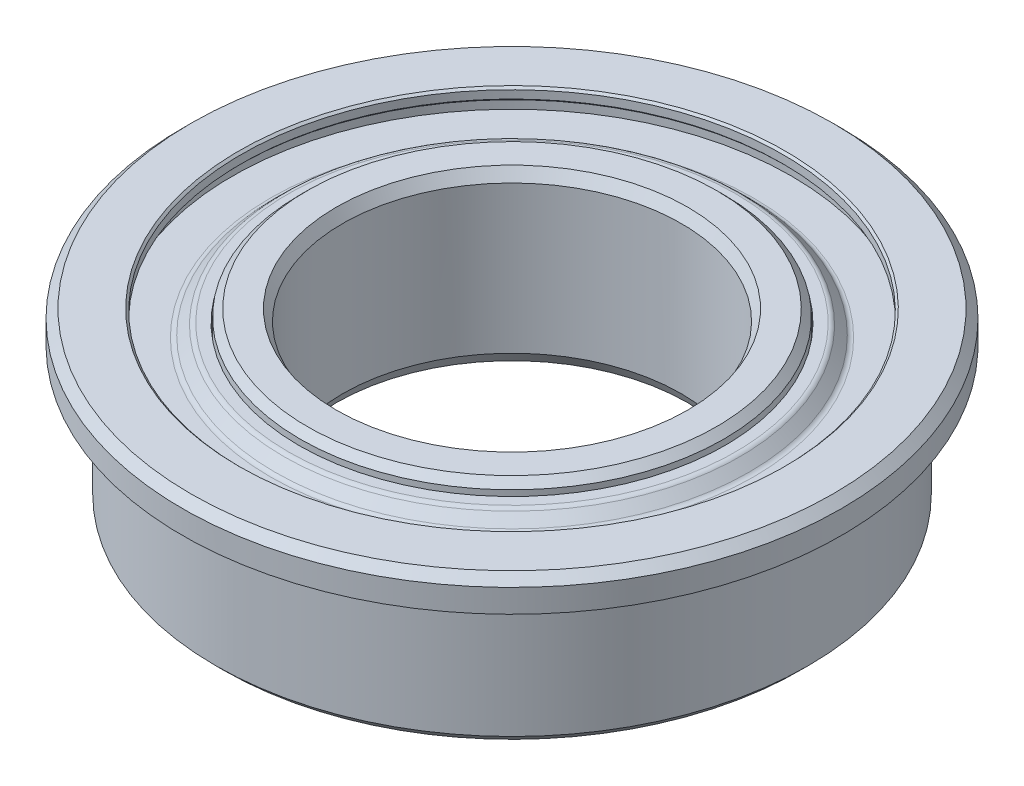
ISO-10303-21;
HEADER;
FILE_DESCRIPTION(('STEP AP214'),'2;1');
FILE_NAME('part.step','',(''),(''),'','','');
FILE_SCHEMA(('AUTOMOTIVE_DESIGN { 1 0 10303 214 1 1 1 1 }'));
ENDSEC;
DATA;
#1=APPLICATION_CONTEXT('core data for automotive mechanical design processes');
#2=APPLICATION_PROTOCOL_DEFINITION('international standard','automotive_design',2000,#1);
#3=PRODUCT_CONTEXT('',#1,'mechanical');
#4=PRODUCT('Part','Part','',(#3));
#5=PRODUCT_RELATED_PRODUCT_CATEGORY('part','',(#4));
#6=PRODUCT_DEFINITION_FORMATION('','',#4);
#7=PRODUCT_DEFINITION_CONTEXT('part definition',#1,'design');
#8=PRODUCT_DEFINITION('design','',#6,#7);
#9=PRODUCT_DEFINITION_SHAPE('','',#8);
#10=(LENGTH_UNIT() NAMED_UNIT(*) SI_UNIT(.MILLI.,.METRE.));
#11=(NAMED_UNIT(*) PLANE_ANGLE_UNIT() SI_UNIT($,.RADIAN.));
#12=(NAMED_UNIT(*) SI_UNIT($,.STERADIAN.) SOLID_ANGLE_UNIT());
#13=UNCERTAINTY_MEASURE_WITH_UNIT(LENGTH_MEASURE(1.E-05),#10,'distance_accuracy_value','');
#14=(GEOMETRIC_REPRESENTATION_CONTEXT(3) GLOBAL_UNCERTAINTY_ASSIGNED_CONTEXT((#13)) GLOBAL_UNIT_ASSIGNED_CONTEXT((#10,
#11,#12)) REPRESENTATION_CONTEXT('',''));
#15=CARTESIAN_POINT('',(0.,0.,0.));
#16=DIRECTION('',(0.,0.,1.));
#17=DIRECTION('',(1.,0.,0.));
#18=AXIS2_PLACEMENT_3D('',#15,#16,#17);
#19=CARTESIAN_POINT('',(0.,3.83000000010725,0.));
#20=DIRECTION('',(0.,-1.,0.));
#21=DIRECTION('',(0.,0.,-1.));
#22=AXIS2_PLACEMENT_3D('',#19,#20,#21);
#23=CONICAL_SURFACE('',#22,4.99999999993861,0.785398163230262);
#24=CARTESIAN_POINT('',(0.,3.83,0.));
#25=DIRECTION('',(0.,1.,0.));
#26=DIRECTION('',(0.,0.,1.));
#27=AXIS2_PLACEMENT_3D('',#24,#25,#26);
#28=CIRCLE('',#27,5.);
#29=CARTESIAN_POINT('',(0.,3.83,5.));
#30=VERTEX_POINT('',#29);
#31=EDGE_CURVE('E410',#30,#30,#28,.F.);
#32=ORIENTED_EDGE('',*,*,#31,.F.);
#33=EDGE_LOOP('',(#32));
#34=FACE_BOUND('',#33,.T.);
#35=CARTESIAN_POINT('',(0.,4.0000000000191,0.));
#36=DIRECTION('',(0.,-1.,0.));
#37=DIRECTION('',(0.,0.,-1.));
#38=AXIS2_PLACEMENT_3D('',#35,#36,#37);
#39=CIRCLE('',#38,4.8300000000836);
#40=CARTESIAN_POINT('',(0.,4.0000000000191,-4.8300000000836));
#41=VERTEX_POINT('',#40);
#42=EDGE_CURVE('E408',#41,#41,#39,.F.);
#43=ORIENTED_EDGE('',*,*,#42,.F.);
#44=EDGE_LOOP('',(#43));
#45=FACE_BOUND('',#44,.T.);
#46=ADVANCED_FACE('F17',(#34,#45),#23,.T.);
#47=CARTESIAN_POINT('',(0.,3.71,0.));
#48=DIRECTION('',(0.,1.,0.));
#49=DIRECTION('',(0.,0.,1.));
#50=AXIS2_PLACEMENT_3D('',#47,#48,#49);
#51=CYLINDRICAL_SURFACE('',#50,5.);
#52=ORIENTED_EDGE('',*,*,#31,.T.);
#53=EDGE_LOOP('',(#52));
#54=FACE_BOUND('',#53,.T.);
#55=CARTESIAN_POINT('',(0.,3.456,0.));
#56=DIRECTION('',(0.,1.,0.));
#57=DIRECTION('',(0.,0.,1.));
#58=AXIS2_PLACEMENT_3D('',#55,#56,#57);
#59=CIRCLE('',#58,5.);
#60=CARTESIAN_POINT('',(0.,3.456,5.));
#61=VERTEX_POINT('',#60);
#62=EDGE_CURVE('E406',#61,#61,#59,.F.);
#63=ORIENTED_EDGE('',*,*,#62,.F.);
#64=EDGE_LOOP('',(#63));
#65=FACE_BOUND('',#64,.T.);
#66=ADVANCED_FACE('F127',(#54,#65),#51,.T.);
#67=CARTESIAN_POINT('',(0.,4.,0.));
#68=DIRECTION('',(0.,1.,0.));
#69=DIRECTION('',(0.,0.,1.));
#70=AXIS2_PLACEMENT_3D('',#67,#68,#69);
#71=PLANE('',#70);
#72=CARTESIAN_POINT('',(0.,4.0000000000191,0.));
#73=DIRECTION('',(0.,1.,0.));
#74=DIRECTION('',(0.,0.,1.));
#75=AXIS2_PLACEMENT_3D('',#72,#73,#74);
#76=CIRCLE('',#75,4.15000000003829);
#77=CARTESIAN_POINT('',(0.,4.0000000000191,4.15000000003829));
#78=VERTEX_POINT('',#77);
#79=EDGE_CURVE('E403',#78,#78,#76,.F.);
#80=ORIENTED_EDGE('',*,*,#79,.T.);
#81=EDGE_LOOP('',(#80));
#82=FACE_BOUND('',#81,.T.);
#83=ORIENTED_EDGE('',*,*,#42,.T.);
#84=EDGE_LOOP('',(#83));
#85=FACE_BOUND('',#84,.T.);
#86=ADVANCED_FACE('F124',(#82,#85),#71,.T.);
#87=CARTESIAN_POINT('',(0.,3.456,0.));
#88=DIRECTION('',(0.,1.,0.));
#89=DIRECTION('',(0.,0.,1.));
#90=AXIS2_PLACEMENT_3D('',#87,#88,#89);
#91=PLANE('',#90);
#92=CARTESIAN_POINT('',(0.,3.456,0.));
#93=DIRECTION('',(0.,1.,0.));
#94=DIRECTION('',(0.,0.,1.));
#95=AXIS2_PLACEMENT_3D('',#92,#93,#94);
#96=CIRCLE('',#95,5.025);
#97=CARTESIAN_POINT('',(0.,3.456,5.025));
#98=VERTEX_POINT('',#97);
#99=EDGE_CURVE('E400',#98,#98,#96,.T.);
#100=ORIENTED_EDGE('',*,*,#99,.T.);
#101=EDGE_LOOP('',(#100));
#102=FACE_BOUND('',#101,.T.);
#103=ORIENTED_EDGE('',*,*,#62,.T.);
#104=EDGE_LOOP('',(#103));
#105=FACE_BOUND('',#104,.T.);
#106=ADVANCED_FACE('F120',(#102,#105),#91,.T.);
#107=CARTESIAN_POINT('',(0.,4.0000000000191,0.));
#108=DIRECTION('',(0.,1.,0.));
#109=DIRECTION('',(0.,0.,1.));
#110=AXIS2_PLACEMENT_3D('',#107,#108,#109);
#111=CONICAL_SURFACE('',#110,4.15000000003829,0.523598775537158);
#112=ORIENTED_EDGE('',*,*,#79,.F.);
#113=EDGE_LOOP('',(#112));
#114=FACE_BOUND('',#113,.T.);
#115=CARTESIAN_POINT('',(0.,3.74019237886466,0.));
#116=DIRECTION('',(0.,1.,0.));
#117=DIRECTION('',(0.,0.,1.));
#118=AXIS2_PLACEMENT_3D('',#115,#116,#117);
#119=CIRCLE('',#118,4.);
#120=CARTESIAN_POINT('',(0.,3.74019237886466,4.));
#121=VERTEX_POINT('',#120);
#122=EDGE_CURVE('E399',#121,#121,#119,.F.);
#123=ORIENTED_EDGE('',*,*,#122,.T.);
#124=EDGE_LOOP('',(#123));
#125=FACE_BOUND('',#124,.T.);
#126=ADVANCED_FACE('F116',(#114,#125),#111,.F.);
#127=CARTESIAN_POINT('',(0.,3.456,0.));
#128=DIRECTION('',(0.,1.,0.));
#129=DIRECTION('',(0.,0.,1.));
#130=AXIS2_PLACEMENT_3D('',#127,#128,#129);
#131=CYLINDRICAL_SURFACE('',#130,5.025);
#132=CARTESIAN_POINT('',(0.,3.71,0.));
#133=DIRECTION('',(0.,1.,0.));
#134=DIRECTION('',(0.,0.,1.));
#135=AXIS2_PLACEMENT_3D('',#132,#133,#134);
#136=CIRCLE('',#135,5.025);
#137=CARTESIAN_POINT('',(0.,3.71,5.025));
#138=VERTEX_POINT('',#137);
#139=EDGE_CURVE('E396',#138,#138,#136,.F.);
#140=ORIENTED_EDGE('',*,*,#139,.F.);
#141=EDGE_LOOP('',(#140));
#142=FACE_BOUND('',#141,.T.);
#143=ORIENTED_EDGE('',*,*,#99,.F.);
#144=EDGE_LOOP('',(#143));
#145=FACE_BOUND('',#144,.T.);
#146=ADVANCED_FACE('F112',(#142,#145),#131,.F.);
#147=CARTESIAN_POINT('',(0.,0.,0.));
#148=DIRECTION('',(0.,1.,0.));
#149=DIRECTION('',(0.,0.,1.));
#150=AXIS2_PLACEMENT_3D('',#147,#148,#149);
#151=CYLINDRICAL_SURFACE('',#150,4.);
#152=ORIENTED_EDGE('',*,*,#122,.F.);
#153=EDGE_LOOP('',(#152));
#154=FACE_BOUND('',#153,.T.);
#155=CARTESIAN_POINT('',(0.,0.259807621091568,0.));
#156=DIRECTION('',(0.,-1.,0.));
#157=DIRECTION('',(0.,0.,-1.));
#158=AXIS2_PLACEMENT_3D('',#155,#156,#157);
#159=CIRCLE('',#158,4.0000000000191);
#160=CARTESIAN_POINT('',(0.,0.259807621091568,-4.0000000000191));
#161=VERTEX_POINT('',#160);
#162=EDGE_CURVE('E65',#161,#161,#159,.T.);
#163=ORIENTED_EDGE('',*,*,#162,.T.);
#164=EDGE_LOOP('',(#163));
#165=FACE_BOUND('',#164,.T.);
#166=ADVANCED_FACE('F108',(#154,#165),#151,.F.);
#167=CARTESIAN_POINT('',(0.,3.71,0.));
#168=DIRECTION('',(0.,1.,0.));
#169=DIRECTION('',(0.,0.,1.));
#170=AXIS2_PLACEMENT_3D('',#167,#168,#169);
#171=PLANE('',#170);
#172=CARTESIAN_POINT('',(0.,3.71,0.));
#173=DIRECTION('',(0.,-1.,0.));
#174=DIRECTION('',(0.,0.,-1.));
#175=AXIS2_PLACEMENT_3D('',#172,#173,#174);
#176=CIRCLE('',#175,5.27978129677861);
#177=CARTESIAN_POINT('',(0.,3.71,-5.27978129677861));
#178=VERTEX_POINT('',#177);
#179=CARTESIAN_POINT('',(0.,3.71,5.27978129677861));
#180=VERTEX_POINT('',#179);
#181=EDGE_CURVE('E63',#178,#180,#176,.T.);
#182=ORIENTED_EDGE('',*,*,#181,.F.);
#183=CARTESIAN_POINT('',(0.,3.71,0.));
#184=DIRECTION('',(0.,-1.,0.));
#185=DIRECTION('',(0.,0.,1.));
#186=AXIS2_PLACEMENT_3D('',#183,#184,#185);
#187=CIRCLE('',#186,5.27978129677861);
#188=EDGE_CURVE('E57',#180,#178,#187,.T.);
#189=ORIENTED_EDGE('',*,*,#188,.F.);
#190=EDGE_LOOP('',(#182,#189));
#191=FACE_BOUND('',#190,.T.);
#192=ORIENTED_EDGE('',*,*,#139,.T.);
#193=EDGE_LOOP('',(#192));
#194=FACE_BOUND('',#193,.T.);
#195=ADVANCED_FACE('F61',(#191,#194),#171,.T.);
#196=CARTESIAN_POINT('',(0.,1.13686837721616E-10,0.));
#197=DIRECTION('',(0.,-1.,0.));
#198=DIRECTION('',(0.,0.,-1.));
#199=AXIS2_PLACEMENT_3D('',#196,#197,#198);
#200=CONICAL_SURFACE('',#199,4.1499999999246,0.523598775537158);
#201=CARTESIAN_POINT('',(0.,-5.6843418860808E-11,0.));
#202=DIRECTION('',(0.,-1.,0.));
#203=DIRECTION('',(0.,0.,-1.));
#204=AXIS2_PLACEMENT_3D('',#201,#202,#203);
#205=CIRCLE('',#204,4.15000000002306);
#206=CARTESIAN_POINT('',(0.,-5.6843418860808E-11,-4.15000000002306));
#207=VERTEX_POINT('',#206);
#208=EDGE_CURVE('E71',#207,#207,#205,.T.);
#209=ORIENTED_EDGE('',*,*,#208,.T.);
#210=EDGE_LOOP('',(#209));
#211=FACE_BOUND('',#210,.T.);
#212=ORIENTED_EDGE('',*,*,#162,.F.);
#213=EDGE_LOOP('',(#212));
#214=FACE_BOUND('',#213,.T.);
#215=ADVANCED_FACE('F91',(#211,#214),#200,.F.);
#216=CARTESIAN_POINT('',(0.,3.56,0.));
#217=DIRECTION('',(0.,1.,0.));
#218=DIRECTION('',(0.,0.,1.));
#219=AXIS2_PLACEMENT_3D('',#216,#217,#218);
#220=TOROIDAL_SURFACE('',#219,5.27978129677861,0.15);
#221=ORIENTED_EDGE('',*,*,#188,.T.);
#222=ORIENTED_EDGE('',*,*,#181,.T.);
#223=EDGE_LOOP('',(#221,#222));
#224=FACE_BOUND('',#223,.T.);
#225=CARTESIAN_POINT('',(0.,3.66606601710373,0.));
#226=DIRECTION('',(0.,-1.,0.));
#227=DIRECTION('',(0.,0.,-1.));
#228=AXIS2_PLACEMENT_3D('',#225,#226,#227);
#229=CIRCLE('',#228,5.38584731395986);
#230=CARTESIAN_POINT('',(0.,3.66606601710373,-5.38584731395986));
#231=VERTEX_POINT('',#230);
#232=EDGE_CURVE('E96',#231,#231,#229,.T.);
#233=ORIENTED_EDGE('',*,*,#232,.F.);
#234=EDGE_LOOP('',(#233));
#235=FACE_BOUND('',#234,.T.);
#236=ADVANCED_FACE('F69',(#224,#235),#220,.T.);
#237=CARTESIAN_POINT('',(0.,0.,0.));
#238=DIRECTION('',(0.,1.,0.));
#239=DIRECTION('',(0.,0.,1.));
#240=AXIS2_PLACEMENT_3D('',#237,#238,#239);
#241=PLANE('',#240);
#242=ORIENTED_EDGE('',*,*,#208,.F.);
#243=EDGE_LOOP('',(#242));
#244=FACE_BOUND('',#243,.T.);
#245=CARTESIAN_POINT('',(0.,0.,0.));
#246=DIRECTION('',(0.,1.,0.));
#247=DIRECTION('',(0.,0.,1.));
#248=AXIS2_PLACEMENT_3D('',#245,#246,#247);
#249=CIRCLE('',#248,4.82999999996991);
#250=CARTESIAN_POINT('',(0.,0.,4.82999999996991));
#251=VERTEX_POINT('',#250);
#252=EDGE_CURVE('E382',#251,#251,#249,.T.);
#253=ORIENTED_EDGE('',*,*,#252,.F.);
#254=EDGE_LOOP('',(#253));
#255=FACE_BOUND('',#254,.T.);
#256=ADVANCED_FACE('F90',(#244,#255),#241,.F.);
#257=CARTESIAN_POINT('',(0.,3.45393398276883,0.));
#258=DIRECTION('',(0.,-1.,0.));
#259=DIRECTION('',(0.,0.,-1.));
#260=AXIS2_PLACEMENT_3D('',#257,#258,#259);
#261=CONICAL_SURFACE('',#260,5.59797934829476,0.785398163397448);
#262=CARTESIAN_POINT('',(0.,3.45393398282202,0.));
#263=DIRECTION('',(0.,1.,0.));
#264=DIRECTION('',(0.,0.,1.));
#265=AXIS2_PLACEMENT_3D('',#262,#263,#264);
#266=CIRCLE('',#265,5.59797934831256);
#267=CARTESIAN_POINT('',(0.,3.45393398282202,5.59797934831256));
#268=VERTEX_POINT('',#267);
#269=EDGE_CURVE('E380',#268,#268,#266,.T.);
#270=ORIENTED_EDGE('',*,*,#269,.T.);
#271=EDGE_LOOP('',(#270));
#272=FACE_BOUND('',#271,.T.);
#273=ORIENTED_EDGE('',*,*,#232,.T.);
#274=EDGE_LOOP('',(#273));
#275=FACE_BOUND('',#274,.T.);
#276=ADVANCED_FACE('F483',(#272,#275),#261,.T.);
#277=CARTESIAN_POINT('',(0.,0.169999999968695,0.));
#278=DIRECTION('',(0.,1.,0.));
#279=DIRECTION('',(0.,0.,1.));
#280=AXIS2_PLACEMENT_3D('',#277,#278,#279);
#281=CONICAL_SURFACE('',#280,4.99999999999545,0.785398163564635);
#282=ORIENTED_EDGE('',*,*,#252,.T.);
#283=EDGE_LOOP('',(#282));
#284=FACE_BOUND('',#283,.T.);
#285=CARTESIAN_POINT('',(0.,0.170000000000001,0.));
#286=DIRECTION('',(0.,-1.,0.));
#287=DIRECTION('',(0.,0.,-1.));
#288=AXIS2_PLACEMENT_3D('',#285,#286,#287);
#289=CIRCLE('',#288,5.);
#290=CARTESIAN_POINT('',(0.,0.170000000000001,-5.));
#291=VERTEX_POINT('',#290);
#292=EDGE_CURVE('E373',#291,#291,#289,.F.);
#293=ORIENTED_EDGE('',*,*,#292,.F.);
#294=EDGE_LOOP('',(#293));
#295=FACE_BOUND('',#294,.T.);
#296=ADVANCED_FACE('F360',(#284,#295),#281,.T.);
#297=CARTESIAN_POINT('',(0.,3.56,0.));
#298=DIRECTION('',(0.,1.,0.));
#299=DIRECTION('',(0.,0.,1.));
#300=AXIS2_PLACEMENT_3D('',#297,#298,#299);
#301=TOROIDAL_SURFACE('',#300,5.70404536549054,0.15);
#302=ORIENTED_EDGE('',*,*,#269,.F.);
#303=EDGE_LOOP('',(#302));
#304=FACE_BOUND('',#303,.T.);
#305=CARTESIAN_POINT('',(0.,3.41,0.));
#306=DIRECTION('',(0.,1.,0.));
#307=DIRECTION('',(0.,0.,-1.));
#308=AXIS2_PLACEMENT_3D('',#305,#306,#307);
#309=CIRCLE('',#308,5.70404536549054);
#310=CARTESIAN_POINT('',(0.,3.41,5.70404536549054));
#311=VERTEX_POINT('',#310);
#312=CARTESIAN_POINT('',(0.,3.41,-5.70404536549054));
#313=VERTEX_POINT('',#312);
#314=EDGE_CURVE('E323',#311,#313,#309,.F.);
#315=ORIENTED_EDGE('',*,*,#314,.F.);
#316=CARTESIAN_POINT('',(0.,3.41,0.));
#317=DIRECTION('',(0.,1.,0.));
#318=DIRECTION('',(0.,0.,1.));
#319=AXIS2_PLACEMENT_3D('',#316,#317,#318);
#320=CIRCLE('',#319,5.70404536549054);
#321=EDGE_CURVE('E473',#313,#311,#320,.F.);
#322=ORIENTED_EDGE('',*,*,#321,.F.);
#323=EDGE_LOOP('',(#315,#322));
#324=FACE_BOUND('',#323,.T.);
#325=ADVANCED_FACE('F356',(#304,#324),#301,.F.);
#326=CARTESIAN_POINT('',(0.,0.3,0.));
#327=DIRECTION('',(0.,-1.,0.));
#328=DIRECTION('',(0.,0.,-1.));
#329=AXIS2_PLACEMENT_3D('',#326,#327,#328);
#330=CYLINDRICAL_SURFACE('',#329,5.);
#331=CARTESIAN_POINT('',(0.,0.544,0.));
#332=DIRECTION('',(0.,-1.,0.));
#333=DIRECTION('',(0.,0.,-1.));
#334=AXIS2_PLACEMENT_3D('',#331,#332,#333);
#335=CIRCLE('',#334,5.);
#336=CARTESIAN_POINT('',(0.,0.544,-5.));
#337=VERTEX_POINT('',#336);
#338=EDGE_CURVE('E392',#337,#337,#335,.F.);
#339=ORIENTED_EDGE('',*,*,#338,.F.);
#340=EDGE_LOOP('',(#339));
#341=FACE_BOUND('',#340,.T.);
#342=ORIENTED_EDGE('',*,*,#292,.T.);
#343=EDGE_LOOP('',(#342));
#344=FACE_BOUND('',#343,.T.);
#345=ADVANCED_FACE('F340',(#341,#344),#330,.T.);
#346=CARTESIAN_POINT('',(0.,3.41,0.));
#347=DIRECTION('',(0.,1.,0.));
#348=DIRECTION('',(0.,0.,1.));
#349=AXIS2_PLACEMENT_3D('',#346,#347,#348);
#350=PLANE('',#349);
#351=CARTESIAN_POINT('',(0.,3.41,0.));
#352=DIRECTION('',(0.,1.,0.));
#353=DIRECTION('',(0.,0.,1.));
#354=AXIS2_PLACEMENT_3D('',#351,#352,#353);
#355=CIRCLE('',#354,6.6);
#356=CARTESIAN_POINT('',(0.,3.41,6.6));
#357=VERTEX_POINT('',#356);
#358=EDGE_CURVE('E469',#357,#357,#355,.T.);
#359=ORIENTED_EDGE('',*,*,#358,.T.);
#360=EDGE_LOOP('',(#359));
#361=FACE_BOUND('',#360,.T.);
#362=ORIENTED_EDGE('',*,*,#314,.T.);
#363=ORIENTED_EDGE('',*,*,#321,.T.);
#364=EDGE_LOOP('',(#362,#363));
#365=FACE_BOUND('',#364,.T.);
#366=ADVANCED_FACE('F329',(#361,#365),#350,.T.);
#367=CARTESIAN_POINT('',(0.,0.544,0.));
#368=DIRECTION('',(0.,-1.,0.));
#369=DIRECTION('',(0.,0.,-1.));
#370=AXIS2_PLACEMENT_3D('',#367,#368,#369);
#371=PLANE('',#370);
#372=CARTESIAN_POINT('',(0.,0.544,0.));
#373=DIRECTION('',(0.,-1.,0.));
#374=DIRECTION('',(0.,0.,-1.));
#375=AXIS2_PLACEMENT_3D('',#372,#373,#374);
#376=CIRCLE('',#375,5.025);
#377=CARTESIAN_POINT('',(0.,0.544,-5.025));
#378=VERTEX_POINT('',#377);
#379=EDGE_CURVE('E467',#378,#378,#376,.T.);
#380=ORIENTED_EDGE('',*,*,#379,.T.);
#381=EDGE_LOOP('',(#380));
#382=FACE_BOUND('',#381,.T.);
#383=ORIENTED_EDGE('',*,*,#338,.T.);
#384=EDGE_LOOP('',(#383));
#385=FACE_BOUND('',#384,.T.);
#386=ADVANCED_FACE('F339',(#382,#385),#371,.T.);
#387=CARTESIAN_POINT('',(0.,3.41,0.));
#388=DIRECTION('',(0.,1.,0.));
#389=DIRECTION('',(0.,0.,1.));
#390=AXIS2_PLACEMENT_3D('',#387,#388,#389);
#391=CYLINDRICAL_SURFACE('',#390,6.6);
#392=ORIENTED_EDGE('',*,*,#358,.F.);
#393=EDGE_LOOP('',(#392));
#394=FACE_BOUND('',#393,.T.);
#395=CARTESIAN_POINT('',(0.,3.71,0.));
#396=DIRECTION('',(0.,1.,0.));
#397=DIRECTION('',(0.,0.,1.));
#398=AXIS2_PLACEMENT_3D('',#395,#396,#397);
#399=CIRCLE('',#398,6.6);
#400=CARTESIAN_POINT('',(0.,3.71,6.6));
#401=VERTEX_POINT('',#400);
#402=EDGE_CURVE('E464',#401,#401,#399,.T.);
#403=ORIENTED_EDGE('',*,*,#402,.T.);
#404=EDGE_LOOP('',(#403));
#405=FACE_BOUND('',#404,.T.);
#406=ADVANCED_FACE('F555',(#394,#405),#391,.F.);
#407=CARTESIAN_POINT('',(0.,0.544,0.));
#408=DIRECTION('',(0.,-1.,0.));
#409=DIRECTION('',(0.,0.,-1.));
#410=AXIS2_PLACEMENT_3D('',#407,#408,#409);
#411=CYLINDRICAL_SURFACE('',#410,5.025);
#412=ORIENTED_EDGE('',*,*,#379,.F.);
#413=EDGE_LOOP('',(#412));
#414=FACE_BOUND('',#413,.T.);
#415=CARTESIAN_POINT('',(0.,0.3,0.));
#416=DIRECTION('',(0.,-1.,0.));
#417=DIRECTION('',(0.,0.,-1.));
#418=AXIS2_PLACEMENT_3D('',#415,#416,#417);
#419=CIRCLE('',#418,5.025);
#420=CARTESIAN_POINT('',(0.,0.3,-5.025));
#421=VERTEX_POINT('',#420);
#422=EDGE_CURVE('E461',#421,#421,#419,.F.);
#423=ORIENTED_EDGE('',*,*,#422,.F.);
#424=EDGE_LOOP('',(#423));
#425=FACE_BOUND('',#424,.T.);
#426=ADVANCED_FACE('F564',(#414,#425),#411,.F.);
#427=CARTESIAN_POINT('',(0.,3.71,0.));
#428=DIRECTION('',(0.,1.,0.));
#429=DIRECTION('',(0.,0.,1.));
#430=AXIS2_PLACEMENT_3D('',#427,#428,#429);
#431=PLANE('',#430);
#432=ORIENTED_EDGE('',*,*,#402,.F.);
#433=EDGE_LOOP('',(#432));
#434=FACE_BOUND('',#433,.T.);
#435=CARTESIAN_POINT('',(0.,3.71000000006916,0.));
#436=DIRECTION('',(0.,-1.,0.));
#437=DIRECTION('',(0.,0.,-1.));
#438=AXIS2_PLACEMENT_3D('',#435,#436,#437);
#439=CIRCLE('',#438,6.44999999991569);
#440=CARTESIAN_POINT('',(0.,3.71000000006916,-6.44999999991569));
#441=VERTEX_POINT('',#440);
#442=EDGE_CURVE('E458',#441,#441,#439,.F.);
#443=ORIENTED_EDGE('',*,*,#442,.T.);
#444=EDGE_LOOP('',(#443));
#445=FACE_BOUND('',#444,.T.);
#446=ADVANCED_FACE('F299',(#434,#445),#431,.F.);
#447=CARTESIAN_POINT('',(0.,0.3,0.));
#448=DIRECTION('',(0.,-1.,0.));
#449=DIRECTION('',(0.,0.,-1.));
#450=AXIS2_PLACEMENT_3D('',#447,#448,#449);
#451=PLANE('',#450);
#452=ORIENTED_EDGE('',*,*,#422,.T.);
#453=EDGE_LOOP('',(#452));
#454=FACE_BOUND('',#453,.T.);
#455=CARTESIAN_POINT('',(0.,0.3,0.));
#456=DIRECTION('',(0.,1.,0.));
#457=DIRECTION('',(0.,0.,1.));
#458=AXIS2_PLACEMENT_3D('',#455,#456,#457);
#459=CIRCLE('',#458,5.27978129677861);
#460=CARTESIAN_POINT('',(0.,0.3,5.27978129677861));
#461=VERTEX_POINT('',#460);
#462=CARTESIAN_POINT('',(0.,0.3,-5.27978129677861));
#463=VERTEX_POINT('',#462);
#464=EDGE_CURVE('E283',#461,#463,#459,.T.);
#465=ORIENTED_EDGE('',*,*,#464,.F.);
#466=CARTESIAN_POINT('',(0.,0.3,0.));
#467=DIRECTION('',(0.,1.,0.));
#468=DIRECTION('',(0.,0.,-1.));
#469=AXIS2_PLACEMENT_3D('',#466,#467,#468);
#470=CIRCLE('',#469,5.27978129677861);
#471=EDGE_CURVE('E252',#463,#461,#470,.T.);
#472=ORIENTED_EDGE('',*,*,#471,.F.);
#473=EDGE_LOOP('',(#465,#472));
#474=FACE_BOUND('',#473,.T.);
#475=ADVANCED_FACE('F290',(#454,#474),#451,.T.);
#476=CARTESIAN_POINT('',(0.,3.71000000018284,0.));
#477=DIRECTION('',(0.,-1.,0.));
#478=DIRECTION('',(0.,0.,-1.));
#479=AXIS2_PLACEMENT_3D('',#476,#477,#478);
#480=CONICAL_SURFACE('',#479,6.449999999802,0.785398163397448);
#481=CARTESIAN_POINT('',(0.,3.76,0.));
#482=DIRECTION('',(0.,1.,0.));
#483=DIRECTION('',(0.,0.,1.));
#484=AXIS2_PLACEMENT_3D('',#481,#482,#483);
#485=CIRCLE('',#484,6.4);
#486=CARTESIAN_POINT('',(0.,3.76,6.4));
#487=VERTEX_POINT('',#486);
#488=EDGE_CURVE('E280',#487,#487,#485,.T.);
#489=ORIENTED_EDGE('',*,*,#488,.T.);
#490=EDGE_LOOP('',(#489));
#491=FACE_BOUND('',#490,.T.);
#492=ORIENTED_EDGE('',*,*,#442,.F.);
#493=EDGE_LOOP('',(#492));
#494=FACE_BOUND('',#493,.T.);
#495=ADVANCED_FACE('F271',(#491,#494),#480,.F.);
#496=CARTESIAN_POINT('',(0.,0.45,0.));
#497=DIRECTION('',(0.,-1.,0.));
#498=DIRECTION('',(0.,0.,-1.));
#499=AXIS2_PLACEMENT_3D('',#496,#497,#498);
#500=TOROIDAL_SURFACE('',#499,5.27978129677861,0.15);
#501=ORIENTED_EDGE('',*,*,#471,.T.);
#502=ORIENTED_EDGE('',*,*,#464,.T.);
#503=EDGE_LOOP('',(#501,#502));
#504=FACE_BOUND('',#503,.T.);
#505=CARTESIAN_POINT('',(0.,0.343933982776434,0.));
#506=DIRECTION('',(0.,1.,0.));
#507=DIRECTION('',(0.,0.,1.));
#508=AXIS2_PLACEMENT_3D('',#505,#506,#507);
#509=CIRCLE('',#508,5.38584731390301);
#510=CARTESIAN_POINT('',(0.,0.343933982776434,5.38584731390301));
#511=VERTEX_POINT('',#510);
#512=EDGE_CURVE('E278',#511,#511,#509,.T.);
#513=ORIENTED_EDGE('',*,*,#512,.F.);
#514=EDGE_LOOP('',(#513));
#515=FACE_BOUND('',#514,.T.);
#516=ADVANCED_FACE('F259',(#504,#515),#500,.T.);
#517=CARTESIAN_POINT('',(0.,3.71,0.));
#518=DIRECTION('',(0.,1.,0.));
#519=DIRECTION('',(0.,0.,1.));
#520=AXIS2_PLACEMENT_3D('',#517,#518,#519);
#521=CYLINDRICAL_SURFACE('',#520,6.4);
#522=ORIENTED_EDGE('',*,*,#488,.F.);
#523=EDGE_LOOP('',(#522));
#524=FACE_BOUND('',#523,.T.);
#525=CARTESIAN_POINT('',(0.,3.94999999997481,0.));
#526=DIRECTION('',(0.,1.,0.));
#527=DIRECTION('',(0.,0.,1.));
#528=AXIS2_PLACEMENT_3D('',#525,#526,#527);
#529=CIRCLE('',#528,6.39999999998508);
#530=CARTESIAN_POINT('',(0.,3.94999999997481,6.39999999998508));
#531=VERTEX_POINT('',#530);
#532=EDGE_CURVE('E768',#531,#531,#529,.T.);
#533=ORIENTED_EDGE('',*,*,#532,.T.);
#534=EDGE_LOOP('',(#533));
#535=FACE_BOUND('',#534,.T.);
#536=ADVANCED_FACE('F270',(#524,#535),#521,.F.);
#537=CARTESIAN_POINT('',(0.,0.546066017193425,0.));
#538=DIRECTION('',(0.,1.,0.));
#539=DIRECTION('',(0.,0.,1.));
#540=AXIS2_PLACEMENT_3D('',#537,#538,#539);
#541=CONICAL_SURFACE('',#540,5.58797934837685,0.785398163538058);
#542=CARTESIAN_POINT('',(0.,0.546066017177981,0.));
#543=DIRECTION('',(0.,-1.,0.));
#544=DIRECTION('',(0.,0.,-1.));
#545=AXIS2_PLACEMENT_3D('',#542,#543,#544);
#546=CIRCLE('',#545,5.58797934831256);
#547=CARTESIAN_POINT('',(0.,0.546066017177981,-5.58797934831256));
#548=VERTEX_POINT('',#547);
#549=EDGE_CURVE('E457',#548,#548,#546,.T.);
#550=ORIENTED_EDGE('',*,*,#549,.T.);
#551=EDGE_LOOP('',(#550));
#552=FACE_BOUND('',#551,.T.);
#553=ORIENTED_EDGE('',*,*,#512,.T.);
#554=EDGE_LOOP('',(#553));
#555=FACE_BOUND('',#554,.T.);
#556=ADVANCED_FACE('F609',(#552,#555),#541,.T.);
#557=CARTESIAN_POINT('',(0.,4.0000000000191,0.));
#558=DIRECTION('',(0.,1.,0.));
#559=DIRECTION('',(0.,0.,1.));
#560=AXIS2_PLACEMENT_3D('',#557,#558,#559);
#561=CONICAL_SURFACE('',#560,6.45000000002938,0.785398163397448);
#562=ORIENTED_EDGE('',*,*,#532,.F.);
#563=EDGE_LOOP('',(#562));
#564=FACE_BOUND('',#563,.T.);
#565=CARTESIAN_POINT('',(0.,4.0000000000191,0.));
#566=DIRECTION('',(0.,1.,0.));
#567=DIRECTION('',(0.,0.,1.));
#568=AXIS2_PLACEMENT_3D('',#565,#566,#567);
#569=CIRCLE('',#568,6.45000000002938);
#570=CARTESIAN_POINT('',(0.,4.0000000000191,6.45000000002938));
#571=VERTEX_POINT('',#570);
#572=EDGE_CURVE('E453',#571,#571,#569,.F.);
#573=ORIENTED_EDGE('',*,*,#572,.F.);
#574=EDGE_LOOP('',(#573));
#575=FACE_BOUND('',#574,.T.);
#576=ADVANCED_FACE('F231',(#564,#575),#561,.F.);
#577=CARTESIAN_POINT('',(0.,0.44,0.));
#578=DIRECTION('',(0.,-1.,0.));
#579=DIRECTION('',(0.,0.,-1.));
#580=AXIS2_PLACEMENT_3D('',#577,#578,#579);
#581=TOROIDAL_SURFACE('',#580,5.69404536549054,0.15);
#582=ORIENTED_EDGE('',*,*,#549,.F.);
#583=EDGE_LOOP('',(#582));
#584=FACE_BOUND('',#583,.T.);
#585=CARTESIAN_POINT('',(0.,0.59,0.));
#586=DIRECTION('',(0.,-1.,0.));
#587=DIRECTION('',(0.,0.,1.));
#588=AXIS2_PLACEMENT_3D('',#585,#586,#587);
#589=CIRCLE('',#588,5.69404536549054);
#590=CARTESIAN_POINT('',(0.,0.59,-5.69404536549054));
#591=VERTEX_POINT('',#590);
#592=CARTESIAN_POINT('',(0.,0.59,5.69404536549054));
#593=VERTEX_POINT('',#592);
#594=EDGE_CURVE('E456',#591,#593,#589,.F.);
#595=ORIENTED_EDGE('',*,*,#594,.F.);
#596=CARTESIAN_POINT('',(0.,0.59,0.));
#597=DIRECTION('',(0.,-1.,0.));
#598=DIRECTION('',(0.,0.,-1.));
#599=AXIS2_PLACEMENT_3D('',#596,#597,#598);
#600=CIRCLE('',#599,5.69404536549054);
#601=EDGE_CURVE('E36',#593,#591,#600,.F.);
#602=ORIENTED_EDGE('',*,*,#601,.F.);
#603=EDGE_LOOP('',(#595,#602));
#604=FACE_BOUND('',#603,.T.);
#605=ADVANCED_FACE('F227',(#584,#604),#581,.F.);
#606=CARTESIAN_POINT('',(0.,4.,0.));
#607=DIRECTION('',(0.,1.,0.));
#608=DIRECTION('',(0.,0.,1.));
#609=AXIS2_PLACEMENT_3D('',#606,#607,#608);
#610=PLANE('',#609);
#611=CARTESIAN_POINT('',(0.,4.,0.));
#612=DIRECTION('',(0.,-1.,0.));
#613=DIRECTION('',(1.,0.,0.));
#614=AXIS2_PLACEMENT_3D('',#611,#612,#613);
#615=CIRCLE('',#614,7.58000000000003);
#616=CARTESIAN_POINT('',(7.58000000000003,4.,0.));
#617=VERTEX_POINT('',#616);
#618=EDGE_CURVE('E450',#617,#617,#615,.T.);
#619=ORIENTED_EDGE('',*,*,#618,.F.);
#620=EDGE_LOOP('',(#619));
#621=FACE_BOUND('',#620,.T.);
#622=ORIENTED_EDGE('',*,*,#572,.T.);
#623=EDGE_LOOP('',(#622));
#624=FACE_BOUND('',#623,.T.);
#625=ADVANCED_FACE('F207',(#621,#624),#610,.T.);
#626=CARTESIAN_POINT('',(0.,0.59,0.));
#627=DIRECTION('',(0.,-1.,0.));
#628=DIRECTION('',(0.,0.,-1.));
#629=AXIS2_PLACEMENT_3D('',#626,#627,#628);
#630=PLANE('',#629);
#631=CARTESIAN_POINT('',(0.,0.59,0.));
#632=DIRECTION('',(0.,-1.,0.));
#633=DIRECTION('',(0.,0.,-1.));
#634=AXIS2_PLACEMENT_3D('',#631,#632,#633);
#635=CIRCLE('',#634,6.6);
#636=CARTESIAN_POINT('',(0.,0.59,-6.6));
#637=VERTEX_POINT('',#636);
#638=EDGE_CURVE('E447',#637,#637,#635,.T.);
#639=ORIENTED_EDGE('',*,*,#638,.T.);
#640=EDGE_LOOP('',(#639));
#641=FACE_BOUND('',#640,.T.);
#642=ORIENTED_EDGE('',*,*,#594,.T.);
#643=ORIENTED_EDGE('',*,*,#601,.T.);
#644=EDGE_LOOP('',(#642,#643));
#645=FACE_BOUND('',#644,.T.);
#646=ADVANCED_FACE('F202',(#641,#645),#630,.T.);
#647=CARTESIAN_POINT('',(0.,3.80000000000003,0.));
#648=DIRECTION('',(0.,-1.,0.));
#649=DIRECTION('',(1.,0.,0.));
#650=AXIS2_PLACEMENT_3D('',#647,#648,#649);
#651=CONICAL_SURFACE('',#650,7.78,0.785398163397442);
#652=ORIENTED_EDGE('',*,*,#618,.T.);
#653=EDGE_LOOP('',(#652));
#654=FACE_BOUND('',#653,.T.);
#655=CARTESIAN_POINT('',(0.,3.80000000000003,0.));
#656=DIRECTION('',(0.,-1.,0.));
#657=DIRECTION('',(0.,0.,-1.));
#658=AXIS2_PLACEMENT_3D('',#655,#656,#657);
#659=CIRCLE('',#658,7.78);
#660=CARTESIAN_POINT('',(0.,3.80000000000003,-7.78));
#661=VERTEX_POINT('',#660);
#662=EDGE_CURVE('E446',#661,#661,#659,.T.);
#663=ORIENTED_EDGE('',*,*,#662,.F.);
#664=EDGE_LOOP('',(#663));
#665=FACE_BOUND('',#664,.T.);
#666=ADVANCED_FACE('F198',(#654,#665),#651,.T.);
#667=CARTESIAN_POINT('',(0.,0.59,0.));
#668=DIRECTION('',(0.,-1.,0.));
#669=DIRECTION('',(0.,0.,-1.));
#670=AXIS2_PLACEMENT_3D('',#667,#668,#669);
#671=CYLINDRICAL_SURFACE('',#670,6.6);
#672=CARTESIAN_POINT('',(0.,0.29,0.));
#673=DIRECTION('',(0.,-1.,0.));
#674=DIRECTION('',(0.,0.,-1.));
#675=AXIS2_PLACEMENT_3D('',#672,#673,#674);
#676=CIRCLE('',#675,6.6);
#677=CARTESIAN_POINT('',(0.,0.29,-6.6));
#678=VERTEX_POINT('',#677);
#679=EDGE_CURVE('E443',#678,#678,#676,.T.);
#680=ORIENTED_EDGE('',*,*,#679,.T.);
#681=EDGE_LOOP('',(#680));
#682=FACE_BOUND('',#681,.T.);
#683=ORIENTED_EDGE('',*,*,#638,.F.);
#684=EDGE_LOOP('',(#683));
#685=FACE_BOUND('',#684,.T.);
#686=ADVANCED_FACE('F194',(#682,#685),#671,.F.);
#687=CARTESIAN_POINT('',(0.,30.0051630305254,0.));
#688=DIRECTION('',(0.,-1.,0.));
#689=DIRECTION('',(0.,0.,-1.));
#690=AXIS2_PLACEMENT_3D('',#687,#688,#689);
#691=CYLINDRICAL_SURFACE('',#690,7.78);
#692=ORIENTED_EDGE('',*,*,#662,.T.);
#693=EDGE_LOOP('',(#692));
#694=FACE_BOUND('',#693,.T.);
#695=CARTESIAN_POINT('',(0.,3.25,0.));
#696=DIRECTION('',(0.,-1.,0.));
#697=DIRECTION('',(0.,0.,-1.));
#698=AXIS2_PLACEMENT_3D('',#695,#696,#697);
#699=CIRCLE('',#698,7.78);
#700=CARTESIAN_POINT('',(0.,3.25,-7.78));
#701=VERTEX_POINT('',#700);
#702=EDGE_CURVE('E440',#701,#701,#699,.F.);
#703=ORIENTED_EDGE('',*,*,#702,.T.);
#704=EDGE_LOOP('',(#703));
#705=FACE_BOUND('',#704,.T.);
#706=ADVANCED_FACE('F190',(#694,#705),#691,.T.);
#707=CARTESIAN_POINT('',(0.,0.29,0.));
#708=DIRECTION('',(0.,-1.,0.));
#709=DIRECTION('',(0.,0.,-1.));
#710=AXIS2_PLACEMENT_3D('',#707,#708,#709);
#711=PLANE('',#710);
#712=ORIENTED_EDGE('',*,*,#679,.F.);
#713=EDGE_LOOP('',(#712));
#714=FACE_BOUND('',#713,.T.);
#715=CARTESIAN_POINT('',(0.,0.290000000006785,0.));
#716=DIRECTION('',(0.,1.,0.));
#717=DIRECTION('',(0.,0.,1.));
#718=AXIS2_PLACEMENT_3D('',#715,#716,#717);
#719=CIRCLE('',#718,6.44999999991569);
#720=CARTESIAN_POINT('',(0.,0.290000000006785,6.44999999991569));
#721=VERTEX_POINT('',#720);
#722=EDGE_CURVE('E437',#721,#721,#719,.F.);
#723=ORIENTED_EDGE('',*,*,#722,.T.);
#724=EDGE_LOOP('',(#723));
#725=FACE_BOUND('',#724,.T.);
#726=ADVANCED_FACE('F186',(#714,#725),#711,.F.);
#727=CARTESIAN_POINT('',(0.,3.25,0.));
#728=DIRECTION('',(0.,1.,0.));
#729=DIRECTION('',(0.,0.,1.));
#730=AXIS2_PLACEMENT_3D('',#727,#728,#729);
#731=PLANE('',#730);
#732=ORIENTED_EDGE('',*,*,#702,.F.);
#733=EDGE_LOOP('',(#732));
#734=FACE_BOUND('',#733,.T.);
#735=CARTESIAN_POINT('',(0.,3.25,0.));
#736=DIRECTION('',(0.,-1.,0.));
#737=DIRECTION('',(0.,0.,-1.));
#738=AXIS2_PLACEMENT_3D('',#735,#736,#737);
#739=CIRCLE('',#738,7.3);
#740=CARTESIAN_POINT('',(0.,3.25,-7.3));
#741=VERTEX_POINT('',#740);
#742=EDGE_CURVE('E434',#741,#741,#739,.F.);
#743=ORIENTED_EDGE('',*,*,#742,.T.);
#744=EDGE_LOOP('',(#743));
#745=FACE_BOUND('',#744,.T.);
#746=ADVANCED_FACE('F182',(#734,#745),#731,.F.);
#747=CARTESIAN_POINT('',(0.,0.290000000006785,0.));
#748=DIRECTION('',(0.,1.,0.));
#749=DIRECTION('',(0.,0.,1.));
#750=AXIS2_PLACEMENT_3D('',#747,#748,#749);
#751=CONICAL_SURFACE('',#750,6.44999999991569,0.785398162829014);
#752=ORIENTED_EDGE('',*,*,#722,.F.);
#753=EDGE_LOOP('',(#752));
#754=FACE_BOUND('',#753,.T.);
#755=CARTESIAN_POINT('',(0.,0.24,0.));
#756=DIRECTION('',(0.,-1.,0.));
#757=DIRECTION('',(0.,0.,-1.));
#758=AXIS2_PLACEMENT_3D('',#755,#756,#757);
#759=CIRCLE('',#758,6.4);
#760=CARTESIAN_POINT('',(0.,0.24,-6.4));
#761=VERTEX_POINT('',#760);
#762=EDGE_CURVE('E433',#761,#761,#759,.T.);
#763=ORIENTED_EDGE('',*,*,#762,.T.);
#764=EDGE_LOOP('',(#763));
#765=FACE_BOUND('',#764,.T.);
#766=ADVANCED_FACE('F178',(#754,#765),#751,.F.);
#767=CARTESIAN_POINT('',(0.,3.35,0.));
#768=DIRECTION('',(0.,-1.,0.));
#769=DIRECTION('',(0.,0.,-1.));
#770=AXIS2_PLACEMENT_3D('',#767,#768,#769);
#771=CYLINDRICAL_SURFACE('',#770,7.3);
#772=ORIENTED_EDGE('',*,*,#742,.F.);
#773=EDGE_LOOP('',(#772));
#774=FACE_BOUND('',#773,.T.);
#775=CARTESIAN_POINT('',(0.,3.35,0.));
#776=DIRECTION('',(0.,-1.,0.));
#777=DIRECTION('',(0.,0.,-1.));
#778=AXIS2_PLACEMENT_3D('',#775,#776,#777);
#779=CIRCLE('',#778,7.3);
#780=CARTESIAN_POINT('',(0.,3.35,-7.3));
#781=VERTEX_POINT('',#780);
#782=EDGE_CURVE('E430',#781,#781,#779,.T.);
#783=ORIENTED_EDGE('',*,*,#782,.F.);
#784=EDGE_LOOP('',(#783));
#785=FACE_BOUND('',#784,.T.);
#786=ADVANCED_FACE('F174',(#774,#785),#771,.F.);
#787=CARTESIAN_POINT('',(0.,0.3,0.));
#788=DIRECTION('',(0.,-1.,0.));
#789=DIRECTION('',(0.,0.,-1.));
#790=AXIS2_PLACEMENT_3D('',#787,#788,#789);
#791=CYLINDRICAL_SURFACE('',#790,6.4);
#792=CARTESIAN_POINT('',(0.,0.0499999999306056,0.));
#793=DIRECTION('',(0.,-1.,0.));
#794=DIRECTION('',(0.,0.,-1.));
#795=AXIS2_PLACEMENT_3D('',#792,#793,#794);
#796=CIRCLE('',#795,6.39999999998508);
#797=CARTESIAN_POINT('',(0.,0.0499999999306056,-6.39999999998508));
#798=VERTEX_POINT('',#797);
#799=EDGE_CURVE('E429',#798,#798,#796,.T.);
#800=ORIENTED_EDGE('',*,*,#799,.T.);
#801=EDGE_LOOP('',(#800));
#802=FACE_BOUND('',#801,.T.);
#803=ORIENTED_EDGE('',*,*,#762,.F.);
#804=EDGE_LOOP('',(#803));
#805=FACE_BOUND('',#804,.T.);
#806=ADVANCED_FACE('F170',(#802,#805),#791,.F.);
#807=CARTESIAN_POINT('',(0.,3.35,0.));
#808=DIRECTION('',(0.,-1.,0.));
#809=DIRECTION('',(0.,0.,-1.));
#810=AXIS2_PLACEMENT_3D('',#807,#808,#809);
#811=PLANE('',#810);
#812=ORIENTED_EDGE('',*,*,#782,.T.);
#813=EDGE_LOOP('',(#812));
#814=FACE_BOUND('',#813,.T.);
#815=CARTESIAN_POINT('',(0.,3.35,0.));
#816=DIRECTION('',(0.,1.,0.));
#817=DIRECTION('',(0.,0.,1.));
#818=AXIS2_PLACEMENT_3D('',#815,#816,#817);
#819=CIRCLE('',#818,6.8);
#820=CARTESIAN_POINT('',(0.,3.35,6.8));
#821=VERTEX_POINT('',#820);
#822=EDGE_CURVE('E426',#821,#821,#819,.F.);
#823=ORIENTED_EDGE('',*,*,#822,.F.);
#824=EDGE_LOOP('',(#823));
#825=FACE_BOUND('',#824,.T.);
#826=ADVANCED_FACE('F166',(#814,#825),#811,.T.);
#827=CARTESIAN_POINT('',(0.,5.6843418860808E-11,0.));
#828=DIRECTION('',(0.,-1.,0.));
#829=DIRECTION('',(0.,0.,-1.));
#830=AXIS2_PLACEMENT_3D('',#827,#828,#829);
#831=CONICAL_SURFACE('',#830,6.44999999985885,0.785398163397448);
#832=CARTESIAN_POINT('',(0.,-5.6843418860808E-11,0.));
#833=DIRECTION('',(0.,-1.,0.));
#834=DIRECTION('',(0.,0.,-1.));
#835=AXIS2_PLACEMENT_3D('',#832,#833,#834);
#836=CIRCLE('',#835,6.44999999997253);
#837=CARTESIAN_POINT('',(0.,-5.6843418860808E-11,-6.44999999997253));
#838=VERTEX_POINT('',#837);
#839=EDGE_CURVE('E423',#838,#838,#836,.T.);
#840=ORIENTED_EDGE('',*,*,#839,.T.);
#841=EDGE_LOOP('',(#840));
#842=FACE_BOUND('',#841,.T.);
#843=ORIENTED_EDGE('',*,*,#799,.F.);
#844=EDGE_LOOP('',(#843));
#845=FACE_BOUND('',#844,.T.);
#846=ADVANCED_FACE('F162',(#842,#845),#831,.F.);
#847=CARTESIAN_POINT('',(0.,0.,0.));
#848=DIRECTION('',(0.,1.,0.));
#849=DIRECTION('',(0.,0.,1.));
#850=AXIS2_PLACEMENT_3D('',#847,#848,#849);
#851=CYLINDRICAL_SURFACE('',#850,6.8);
#852=CARTESIAN_POINT('',(0.,2.95,0.));
#853=DIRECTION('',(0.,1.,0.));
#854=DIRECTION('',(0.,0.,1.));
#855=AXIS2_PLACEMENT_3D('',#852,#853,#854);
#856=CIRCLE('',#855,6.8);
#857=CARTESIAN_POINT('',(0.,2.95,6.8));
#858=VERTEX_POINT('',#857);
#859=EDGE_CURVE('E420',#858,#858,#856,.F.);
#860=ORIENTED_EDGE('',*,*,#859,.F.);
#861=EDGE_LOOP('',(#860));
#862=FACE_BOUND('',#861,.T.);
#863=ORIENTED_EDGE('',*,*,#822,.T.);
#864=EDGE_LOOP('',(#863));
#865=FACE_BOUND('',#864,.T.);
#866=ADVANCED_FACE('F158',(#862,#865),#851,.T.);
#867=CARTESIAN_POINT('',(0.,0.,0.));
#868=DIRECTION('',(0.,1.,0.));
#869=DIRECTION('',(0.,0.,1.));
#870=AXIS2_PLACEMENT_3D('',#867,#868,#869);
#871=PLANE('',#870);
#872=CARTESIAN_POINT('',(0.,0.,0.));
#873=DIRECTION('',(0.,1.,0.));
#874=DIRECTION('',(0.,0.,1.));
#875=AXIS2_PLACEMENT_3D('',#872,#873,#874);
#876=CIRCLE('',#875,6.79999999999999);
#877=CARTESIAN_POINT('',(0.,0.,6.79999999999999));
#878=VERTEX_POINT('',#877);
#879=EDGE_CURVE('E417',#878,#878,#876,.T.);
#880=ORIENTED_EDGE('',*,*,#879,.F.);
#881=EDGE_LOOP('',(#880));
#882=FACE_BOUND('',#881,.T.);
#883=ORIENTED_EDGE('',*,*,#839,.F.);
#884=EDGE_LOOP('',(#883));
#885=FACE_BOUND('',#884,.T.);
#886=ADVANCED_FACE('F154',(#882,#885),#871,.F.);
#887=CARTESIAN_POINT('',(7.,2.95,0.));
#888=DIRECTION('',(0.,1.,0.));
#889=DIRECTION('',(0.,0.,1.));
#890=AXIS2_PLACEMENT_3D('',#887,#888,#889);
#891=PLANE('',#890);
#892=ORIENTED_EDGE('',*,*,#859,.T.);
#893=EDGE_LOOP('',(#892));
#894=FACE_BOUND('',#893,.T.);
#895=CARTESIAN_POINT('',(0.,2.95,0.));
#896=DIRECTION('',(0.,-1.,0.));
#897=DIRECTION('',(0.,0.,-1.));
#898=AXIS2_PLACEMENT_3D('',#895,#896,#897);
#899=CIRCLE('',#898,7.);
#900=CARTESIAN_POINT('',(0.,2.95,-7.));
#901=VERTEX_POINT('',#900);
#902=EDGE_CURVE('E28',#901,#901,#899,.T.);
#903=ORIENTED_EDGE('',*,*,#902,.F.);
#904=EDGE_LOOP('',(#903));
#905=FACE_BOUND('',#904,.T.);
#906=ADVANCED_FACE('F146',(#894,#905),#891,.T.);
#907=CARTESIAN_POINT('',(0.,0.200000000000009,0.));
#908=DIRECTION('',(0.,1.,0.));
#909=DIRECTION('',(0.,0.,1.));
#910=AXIS2_PLACEMENT_3D('',#907,#908,#909);
#911=CONICAL_SURFACE('',#910,7.,0.785398163397458);
#912=CARTESIAN_POINT('',(0.,0.200000000000009,0.));
#913=DIRECTION('',(0.,-1.,0.));
#914=DIRECTION('',(0.,0.,-1.));
#915=AXIS2_PLACEMENT_3D('',#912,#913,#914);
#916=CIRCLE('',#915,7.);
#917=CARTESIAN_POINT('',(0.,0.200000000000009,-7.));
#918=VERTEX_POINT('',#917);
#919=EDGE_CURVE('E11',#918,#918,#916,.F.);
#920=ORIENTED_EDGE('',*,*,#919,.F.);
#921=EDGE_LOOP('',(#920));
#922=FACE_BOUND('',#921,.T.);
#923=ORIENTED_EDGE('',*,*,#879,.T.);
#924=EDGE_LOOP('',(#923));
#925=FACE_BOUND('',#924,.T.);
#926=ADVANCED_FACE('F140',(#922,#925),#911,.T.);
#927=CARTESIAN_POINT('',(0.,3.25,0.));
#928=DIRECTION('',(0.,-1.,0.));
#929=DIRECTION('',(0.,0.,-1.));
#930=AXIS2_PLACEMENT_3D('',#927,#928,#929);
#931=CYLINDRICAL_SURFACE('',#930,7.);
#932=ORIENTED_EDGE('',*,*,#902,.T.);
#933=EDGE_LOOP('',(#932));
#934=FACE_BOUND('',#933,.T.);
#935=ORIENTED_EDGE('',*,*,#919,.T.);
#936=EDGE_LOOP('',(#935));
#937=FACE_BOUND('',#936,.T.);
#938=ADVANCED_FACE('F138',(#934,#937),#931,.T.);
#939=CLOSED_SHELL('',(#46,#66,#86,#106,#126,#146,#166,#195,#215,#236,#256,#276,#296,#325,#345,
#366,#386,#406,#426,#446,#475,#495,#516,#536,#556,#576,#605,#625,#646,#666,#686,#706,#726,#746,
#766,#786,#806,#826,#846,#866,#886,#906,#926,#938));
#940=MANIFOLD_SOLID_BREP('B1',#939);
#941=ADVANCED_BREP_SHAPE_REPRESENTATION('',(#18,#940),#14);
#942=SHAPE_DEFINITION_REPRESENTATION(#9,#941);
ENDSEC;
END-ISO-10303-21;
